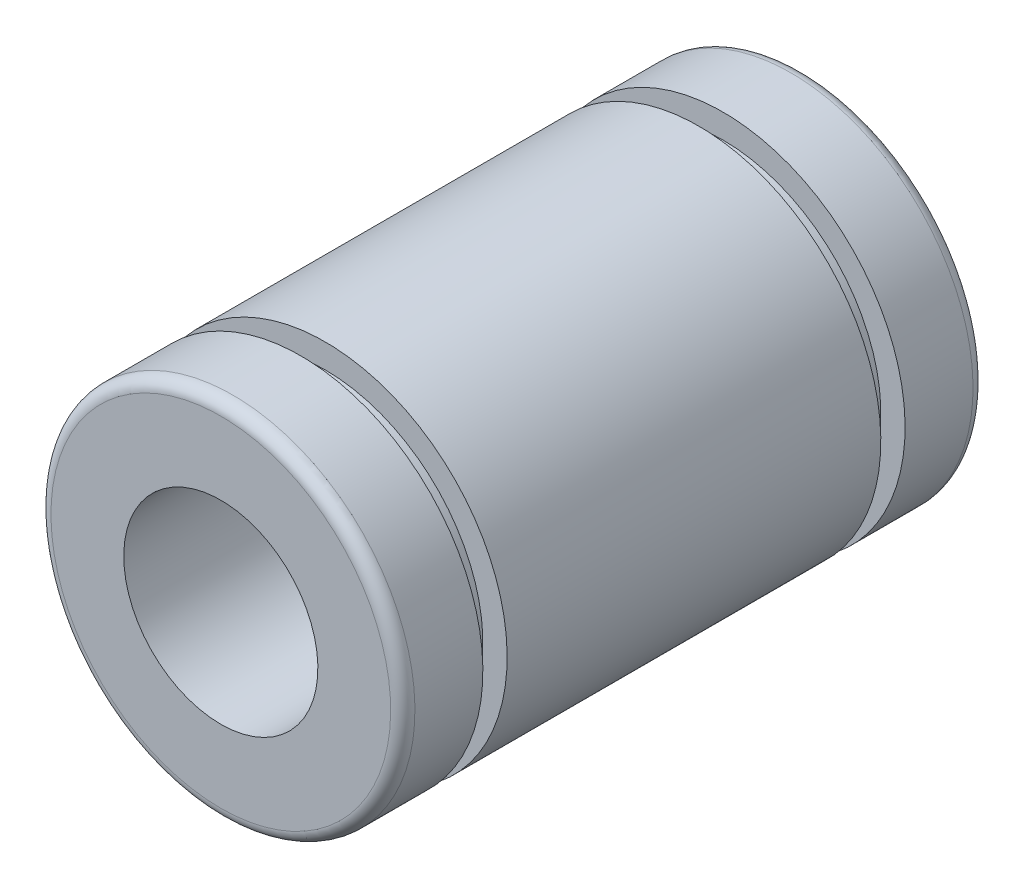
ISO-10303-21;
HEADER;
FILE_DESCRIPTION(('STEP AP214'),'2;1');
FILE_NAME('part.step','',(''),(''),'','','');
FILE_SCHEMA(('AUTOMOTIVE_DESIGN { 1 0 10303 214 1 1 1 1 }'));
ENDSEC;
DATA;
#1=APPLICATION_CONTEXT('core data for automotive mechanical design processes');
#2=APPLICATION_PROTOCOL_DEFINITION('international standard','automotive_design',2000,#1);
#3=PRODUCT_CONTEXT('',#1,'mechanical');
#4=PRODUCT('Part','Part','',(#3));
#5=PRODUCT_RELATED_PRODUCT_CATEGORY('part','',(#4));
#6=PRODUCT_DEFINITION_FORMATION('','',#4);
#7=PRODUCT_DEFINITION_CONTEXT('part definition',#1,'design');
#8=PRODUCT_DEFINITION('design','',#6,#7);
#9=PRODUCT_DEFINITION_SHAPE('','',#8);
#10=(LENGTH_UNIT() NAMED_UNIT(*) SI_UNIT(.MILLI.,.METRE.));
#11=(NAMED_UNIT(*) PLANE_ANGLE_UNIT() SI_UNIT($,.RADIAN.));
#12=(NAMED_UNIT(*) SI_UNIT($,.STERADIAN.) SOLID_ANGLE_UNIT());
#13=UNCERTAINTY_MEASURE_WITH_UNIT(LENGTH_MEASURE(1.E-05),#10,'distance_accuracy_value','');
#14=(GEOMETRIC_REPRESENTATION_CONTEXT(3) GLOBAL_UNCERTAINTY_ASSIGNED_CONTEXT((#13)) GLOBAL_UNIT_ASSIGNED_CONTEXT((#10,
#11,#12)) REPRESENTATION_CONTEXT('',''));
#15=CARTESIAN_POINT('',(0.,0.,0.));
#16=DIRECTION('',(0.,0.,1.));
#17=DIRECTION('',(1.,0.,0.));
#18=AXIS2_PLACEMENT_3D('',#15,#16,#17);
#19=CARTESIAN_POINT('',(0.,0.,11.5));
#20=DIRECTION('',(0.,0.,1.));
#21=DIRECTION('',(0.,-1.,0.));
#22=AXIS2_PLACEMENT_3D('',#19,#20,#21);
#23=TOROIDAL_SURFACE('',#22,7.,0.499999999999997);
#24=CARTESIAN_POINT('',(0.,0.,12.));
#25=DIRECTION('',(0.,0.,1.));
#26=DIRECTION('',(0.,-1.,0.));
#27=AXIS2_PLACEMENT_3D('',#24,#25,#26);
#28=CIRCLE('',#27,7.);
#29=CARTESIAN_POINT('',(0.,-7.,12.));
#30=VERTEX_POINT('',#29);
#31=EDGE_CURVE('E78',#30,#30,#28,.T.);
#32=ORIENTED_EDGE('',*,*,#31,.F.);
#33=EDGE_LOOP('',(#32));
#34=FACE_BOUND('',#33,.T.);
#35=CARTESIAN_POINT('',(0.,0.,11.5));
#36=DIRECTION('',(0.,0.,1.));
#37=DIRECTION('',(0.,-1.,0.));
#38=AXIS2_PLACEMENT_3D('',#35,#36,#37);
#39=CIRCLE('',#38,7.5);
#40=CARTESIAN_POINT('',(0.,-7.5,11.5));
#41=VERTEX_POINT('',#40);
#42=EDGE_CURVE('E10',#41,#41,#39,.T.);
#43=ORIENTED_EDGE('',*,*,#42,.T.);
#44=EDGE_LOOP('',(#43));
#45=FACE_BOUND('',#44,.T.);
#46=ADVANCED_FACE('F32',(#34,#45),#23,.T.);
#47=CARTESIAN_POINT('',(0.,0.,12.));
#48=DIRECTION('',(0.,0.,1.));
#49=DIRECTION('',(0.,-1.,0.));
#50=AXIS2_PLACEMENT_3D('',#47,#48,#49);
#51=CYLINDRICAL_SURFACE('',#50,7.5);
#52=CARTESIAN_POINT('',(0.,0.,8.7));
#53=DIRECTION('',(0.,0.,1.));
#54=DIRECTION('',(0.,-1.,0.));
#55=AXIS2_PLACEMENT_3D('',#52,#53,#54);
#56=CIRCLE('',#55,7.5);
#57=CARTESIAN_POINT('',(0.,-7.5,8.7));
#58=VERTEX_POINT('',#57);
#59=EDGE_CURVE('E38',#58,#58,#56,.T.);
#60=ORIENTED_EDGE('',*,*,#59,.T.);
#61=EDGE_LOOP('',(#60));
#62=FACE_BOUND('',#61,.T.);
#63=ORIENTED_EDGE('',*,*,#42,.F.);
#64=EDGE_LOOP('',(#63));
#65=FACE_BOUND('',#64,.T.);
#66=ADVANCED_FACE('F86',(#62,#65),#51,.T.);
#67=CARTESIAN_POINT('',(0.,0.,8.7));
#68=DIRECTION('',(0.,0.,-1.));
#69=DIRECTION('',(0.,1.,0.));
#70=AXIS2_PLACEMENT_3D('',#67,#68,#69);
#71=PLANE('',#70);
#72=CARTESIAN_POINT('',(0.,0.,8.7));
#73=DIRECTION('',(0.,0.,1.));
#74=DIRECTION('',(0.,-1.,0.));
#75=AXIS2_PLACEMENT_3D('',#72,#73,#74);
#76=CIRCLE('',#75,6.5);
#77=CARTESIAN_POINT('',(0.,-6.5,8.7));
#78=VERTEX_POINT('',#77);
#79=EDGE_CURVE('E42',#78,#78,#76,.T.);
#80=ORIENTED_EDGE('',*,*,#79,.T.);
#81=EDGE_LOOP('',(#80));
#82=FACE_BOUND('',#81,.T.);
#83=ORIENTED_EDGE('',*,*,#59,.F.);
#84=EDGE_LOOP('',(#83));
#85=FACE_BOUND('',#84,.T.);
#86=ADVANCED_FACE('F90',(#82,#85),#71,.T.);
#87=CARTESIAN_POINT('',(0.,0.,12.));
#88=DIRECTION('',(0.,0.,1.));
#89=DIRECTION('',(0.,-1.,0.));
#90=AXIS2_PLACEMENT_3D('',#87,#88,#89);
#91=CYLINDRICAL_SURFACE('',#90,6.5);
#92=CARTESIAN_POINT('',(0.,0.,7.7));
#93=DIRECTION('',(0.,0.,1.));
#94=DIRECTION('',(0.,-1.,0.));
#95=AXIS2_PLACEMENT_3D('',#92,#93,#94);
#96=CIRCLE('',#95,6.5);
#97=CARTESIAN_POINT('',(0.,-6.5,7.7));
#98=VERTEX_POINT('',#97);
#99=EDGE_CURVE('E46',#98,#98,#96,.T.);
#100=ORIENTED_EDGE('',*,*,#99,.T.);
#101=EDGE_LOOP('',(#100));
#102=FACE_BOUND('',#101,.T.);
#103=ORIENTED_EDGE('',*,*,#79,.F.);
#104=EDGE_LOOP('',(#103));
#105=FACE_BOUND('',#104,.T.);
#106=ADVANCED_FACE('F94',(#102,#105),#91,.T.);
#107=CARTESIAN_POINT('',(0.,0.,7.7));
#108=DIRECTION('',(0.,0.,1.));
#109=DIRECTION('',(0.,-1.,0.));
#110=AXIS2_PLACEMENT_3D('',#107,#108,#109);
#111=PLANE('',#110);
#112=CARTESIAN_POINT('',(0.,0.,7.7));
#113=DIRECTION('',(0.,0.,1.));
#114=DIRECTION('',(0.,-1.,0.));
#115=AXIS2_PLACEMENT_3D('',#112,#113,#114);
#116=CIRCLE('',#115,7.5);
#117=CARTESIAN_POINT('',(0.,-7.5,7.7));
#118=VERTEX_POINT('',#117);
#119=EDGE_CURVE('E51',#118,#118,#116,.T.);
#120=ORIENTED_EDGE('',*,*,#119,.T.);
#121=EDGE_LOOP('',(#120));
#122=FACE_BOUND('',#121,.T.);
#123=ORIENTED_EDGE('',*,*,#99,.F.);
#124=EDGE_LOOP('',(#123));
#125=FACE_BOUND('',#124,.T.);
#126=ADVANCED_FACE('F101',(#122,#125),#111,.T.);
#127=CARTESIAN_POINT('',(0.,0.,12.));
#128=DIRECTION('',(0.,0.,1.));
#129=DIRECTION('',(0.,-1.,0.));
#130=AXIS2_PLACEMENT_3D('',#127,#128,#129);
#131=CYLINDRICAL_SURFACE('',#130,7.5);
#132=CARTESIAN_POINT('',(0.,0.,-7.7));
#133=DIRECTION('',(0.,0.,1.));
#134=DIRECTION('',(0.,-1.,0.));
#135=AXIS2_PLACEMENT_3D('',#132,#133,#134);
#136=CIRCLE('',#135,7.5);
#137=CARTESIAN_POINT('',(0.,-7.5,-7.7));
#138=VERTEX_POINT('',#137);
#139=EDGE_CURVE('E54',#138,#138,#136,.T.);
#140=ORIENTED_EDGE('',*,*,#139,.T.);
#141=EDGE_LOOP('',(#140));
#142=FACE_BOUND('',#141,.T.);
#143=ORIENTED_EDGE('',*,*,#119,.F.);
#144=EDGE_LOOP('',(#143));
#145=FACE_BOUND('',#144,.T.);
#146=ADVANCED_FACE('F105',(#142,#145),#131,.T.);
#147=CARTESIAN_POINT('',(0.,0.,-7.7));
#148=DIRECTION('',(0.,0.,1.));
#149=DIRECTION('',(0.,-1.,0.));
#150=AXIS2_PLACEMENT_3D('',#147,#148,#149);
#151=PLANE('',#150);
#152=ORIENTED_EDGE('',*,*,#139,.F.);
#153=EDGE_LOOP('',(#152));
#154=FACE_BOUND('',#153,.T.);
#155=CARTESIAN_POINT('',(0.,0.,-7.7));
#156=DIRECTION('',(0.,0.,1.));
#157=DIRECTION('',(0.,-1.,0.));
#158=AXIS2_PLACEMENT_3D('',#155,#156,#157);
#159=CIRCLE('',#158,6.5);
#160=CARTESIAN_POINT('',(0.,-6.5,-7.7));
#161=VERTEX_POINT('',#160);
#162=EDGE_CURVE('E57',#161,#161,#159,.T.);
#163=ORIENTED_EDGE('',*,*,#162,.T.);
#164=EDGE_LOOP('',(#163));
#165=FACE_BOUND('',#164,.T.);
#166=ADVANCED_FACE('F109',(#154,#165),#151,.F.);
#167=CARTESIAN_POINT('',(0.,0.,12.));
#168=DIRECTION('',(0.,0.,1.));
#169=DIRECTION('',(0.,-1.,0.));
#170=AXIS2_PLACEMENT_3D('',#167,#168,#169);
#171=CYLINDRICAL_SURFACE('',#170,6.5);
#172=ORIENTED_EDGE('',*,*,#162,.F.);
#173=EDGE_LOOP('',(#172));
#174=FACE_BOUND('',#173,.T.);
#175=CARTESIAN_POINT('',(0.,0.,-8.7));
#176=DIRECTION('',(0.,0.,1.));
#177=DIRECTION('',(0.,-1.,0.));
#178=AXIS2_PLACEMENT_3D('',#175,#176,#177);
#179=CIRCLE('',#178,6.5);
#180=CARTESIAN_POINT('',(0.,-6.5,-8.7));
#181=VERTEX_POINT('',#180);
#182=EDGE_CURVE('E60',#181,#181,#179,.T.);
#183=ORIENTED_EDGE('',*,*,#182,.T.);
#184=EDGE_LOOP('',(#183));
#185=FACE_BOUND('',#184,.T.);
#186=ADVANCED_FACE('F113',(#174,#185),#171,.T.);
#187=CARTESIAN_POINT('',(0.,0.,-8.7));
#188=DIRECTION('',(0.,0.,-1.));
#189=DIRECTION('',(0.,1.,0.));
#190=AXIS2_PLACEMENT_3D('',#187,#188,#189);
#191=PLANE('',#190);
#192=ORIENTED_EDGE('',*,*,#182,.F.);
#193=EDGE_LOOP('',(#192));
#194=FACE_BOUND('',#193,.T.);
#195=CARTESIAN_POINT('',(0.,0.,-8.70000000000001));
#196=DIRECTION('',(0.,0.,1.));
#197=DIRECTION('',(0.,-1.,0.));
#198=AXIS2_PLACEMENT_3D('',#195,#196,#197);
#199=CIRCLE('',#198,7.5);
#200=CARTESIAN_POINT('',(0.,-7.5,-8.70000000000001));
#201=VERTEX_POINT('',#200);
#202=EDGE_CURVE('E63',#201,#201,#199,.T.);
#203=ORIENTED_EDGE('',*,*,#202,.T.);
#204=EDGE_LOOP('',(#203));
#205=FACE_BOUND('',#204,.T.);
#206=ADVANCED_FACE('F117',(#194,#205),#191,.F.);
#207=CARTESIAN_POINT('',(0.,0.,12.));
#208=DIRECTION('',(0.,0.,1.));
#209=DIRECTION('',(0.,-1.,0.));
#210=AXIS2_PLACEMENT_3D('',#207,#208,#209);
#211=CYLINDRICAL_SURFACE('',#210,7.5);
#212=ORIENTED_EDGE('',*,*,#202,.F.);
#213=EDGE_LOOP('',(#212));
#214=FACE_BOUND('',#213,.T.);
#215=CARTESIAN_POINT('',(0.,0.,-11.5));
#216=DIRECTION('',(0.,0.,1.));
#217=DIRECTION('',(0.,-1.,0.));
#218=AXIS2_PLACEMENT_3D('',#215,#216,#217);
#219=CIRCLE('',#218,7.5);
#220=CARTESIAN_POINT('',(0.,-7.5,-11.5));
#221=VERTEX_POINT('',#220);
#222=EDGE_CURVE('E66',#221,#221,#219,.T.);
#223=ORIENTED_EDGE('',*,*,#222,.T.);
#224=EDGE_LOOP('',(#223));
#225=FACE_BOUND('',#224,.T.);
#226=ADVANCED_FACE('F121',(#214,#225),#211,.T.);
#227=CARTESIAN_POINT('',(0.,0.,-11.5));
#228=DIRECTION('',(0.,0.,1.));
#229=DIRECTION('',(0.,-1.,0.));
#230=AXIS2_PLACEMENT_3D('',#227,#228,#229);
#231=TOROIDAL_SURFACE('',#230,7.,0.499999999999997);
#232=ORIENTED_EDGE('',*,*,#222,.F.);
#233=EDGE_LOOP('',(#232));
#234=FACE_BOUND('',#233,.T.);
#235=CARTESIAN_POINT('',(0.,0.,-12.));
#236=DIRECTION('',(0.,0.,1.));
#237=DIRECTION('',(0.,-1.,0.));
#238=AXIS2_PLACEMENT_3D('',#235,#236,#237);
#239=CIRCLE('',#238,7.);
#240=CARTESIAN_POINT('',(0.,-7.,-12.));
#241=VERTEX_POINT('',#240);
#242=EDGE_CURVE('E69',#241,#241,#239,.T.);
#243=ORIENTED_EDGE('',*,*,#242,.T.);
#244=EDGE_LOOP('',(#243));
#245=FACE_BOUND('',#244,.T.);
#246=ADVANCED_FACE('F125',(#234,#245),#231,.T.);
#247=CARTESIAN_POINT('',(0.,0.,-12.));
#248=DIRECTION('',(0.,0.,1.));
#249=DIRECTION('',(0.,-1.,0.));
#250=AXIS2_PLACEMENT_3D('',#247,#248,#249);
#251=PLANE('',#250);
#252=ORIENTED_EDGE('',*,*,#242,.F.);
#253=EDGE_LOOP('',(#252));
#254=FACE_BOUND('',#253,.T.);
#255=CARTESIAN_POINT('',(0.,0.,-12.));
#256=DIRECTION('',(0.,0.,1.));
#257=DIRECTION('',(0.,-1.,0.));
#258=AXIS2_PLACEMENT_3D('',#255,#256,#257);
#259=CIRCLE('',#258,4.);
#260=CARTESIAN_POINT('',(0.,-4.,-12.));
#261=VERTEX_POINT('',#260);
#262=EDGE_CURVE('E72',#261,#261,#259,.T.);
#263=ORIENTED_EDGE('',*,*,#262,.T.);
#264=EDGE_LOOP('',(#263));
#265=FACE_BOUND('',#264,.T.);
#266=ADVANCED_FACE('F129',(#254,#265),#251,.F.);
#267=CARTESIAN_POINT('',(0.,0.,12.));
#268=DIRECTION('',(0.,0.,1.));
#269=DIRECTION('',(0.,-1.,0.));
#270=AXIS2_PLACEMENT_3D('',#267,#268,#269);
#271=CYLINDRICAL_SURFACE('',#270,4.);
#272=ORIENTED_EDGE('',*,*,#262,.F.);
#273=EDGE_LOOP('',(#272));
#274=FACE_BOUND('',#273,.T.);
#275=CARTESIAN_POINT('',(0.,0.,12.));
#276=DIRECTION('',(0.,0.,1.));
#277=DIRECTION('',(0.,-1.,0.));
#278=AXIS2_PLACEMENT_3D('',#275,#276,#277);
#279=CIRCLE('',#278,4.);
#280=CARTESIAN_POINT('',(0.,-4.,12.));
#281=VERTEX_POINT('',#280);
#282=EDGE_CURVE('E75',#281,#281,#279,.T.);
#283=ORIENTED_EDGE('',*,*,#282,.T.);
#284=EDGE_LOOP('',(#283));
#285=FACE_BOUND('',#284,.T.);
#286=ADVANCED_FACE('F133',(#274,#285),#271,.F.);
#287=CARTESIAN_POINT('',(0.,0.,12.));
#288=DIRECTION('',(0.,0.,1.));
#289=DIRECTION('',(0.,-1.,0.));
#290=AXIS2_PLACEMENT_3D('',#287,#288,#289);
#291=PLANE('',#290);
#292=ORIENTED_EDGE('',*,*,#31,.T.);
#293=EDGE_LOOP('',(#292));
#294=FACE_BOUND('',#293,.T.);
#295=ORIENTED_EDGE('',*,*,#282,.F.);
#296=EDGE_LOOP('',(#295));
#297=FACE_BOUND('',#296,.T.);
#298=ADVANCED_FACE('F82',(#294,#297),#291,.T.);
#299=CLOSED_SHELL('',(#46,#66,#86,#106,#126,#146,#166,#186,#206,#226,#246,#266,#286,#298));
#300=MANIFOLD_SOLID_BREP('B2',#299);
#301=ADVANCED_BREP_SHAPE_REPRESENTATION('',(#18,#300),#14);
#302=SHAPE_DEFINITION_REPRESENTATION(#9,#301);
ENDSEC;
END-ISO-10303-21;
